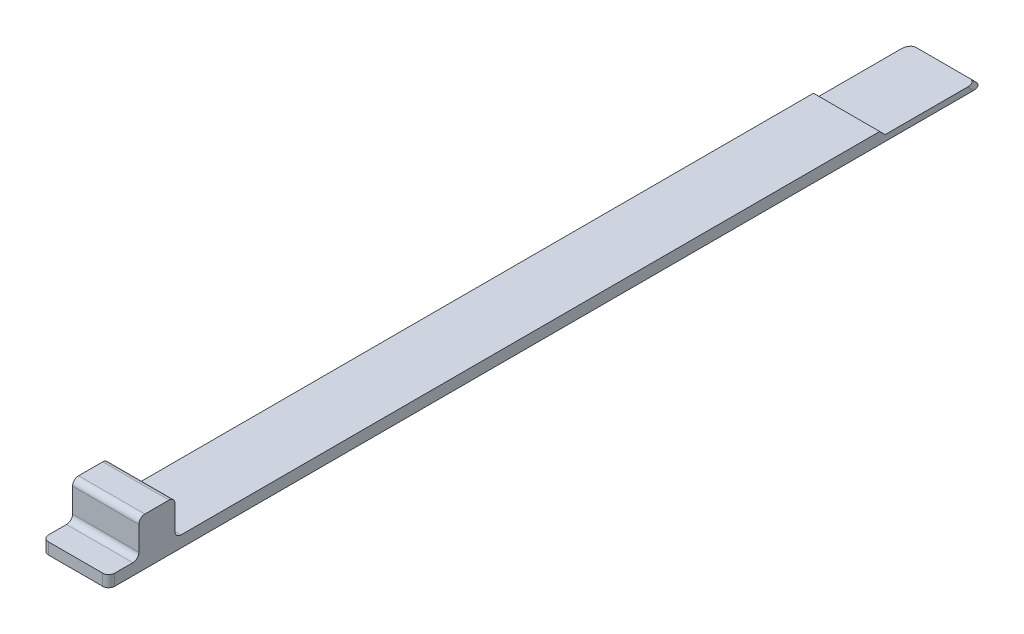
ISO-10303-21;
HEADER;
FILE_DESCRIPTION(('STEP AP214'),'2;1');
FILE_NAME('part.step','',(''),(''),'','','');
FILE_SCHEMA(('AUTOMOTIVE_DESIGN { 1 0 10303 214 1 1 1 1 }'));
ENDSEC;
DATA;
#1=APPLICATION_CONTEXT('core data for automotive mechanical design processes');
#2=APPLICATION_PROTOCOL_DEFINITION('international standard','automotive_design',2000,#1);
#3=PRODUCT_CONTEXT('',#1,'mechanical');
#4=PRODUCT('Part','Part','',(#3));
#5=PRODUCT_RELATED_PRODUCT_CATEGORY('part','',(#4));
#6=PRODUCT_DEFINITION_FORMATION('','',#4);
#7=PRODUCT_DEFINITION_CONTEXT('part definition',#1,'design');
#8=PRODUCT_DEFINITION('design','',#6,#7);
#9=PRODUCT_DEFINITION_SHAPE('','',#8);
#10=(LENGTH_UNIT() NAMED_UNIT(*) SI_UNIT(.MILLI.,.METRE.));
#11=(NAMED_UNIT(*) PLANE_ANGLE_UNIT() SI_UNIT($,.RADIAN.));
#12=(NAMED_UNIT(*) SI_UNIT($,.STERADIAN.) SOLID_ANGLE_UNIT());
#13=UNCERTAINTY_MEASURE_WITH_UNIT(LENGTH_MEASURE(1.E-05),#10,'distance_accuracy_value','');
#14=(GEOMETRIC_REPRESENTATION_CONTEXT(3) GLOBAL_UNCERTAINTY_ASSIGNED_CONTEXT((#13)) GLOBAL_UNIT_ASSIGNED_CONTEXT((#10,
#11,#12)) REPRESENTATION_CONTEXT('',''));
#15=CARTESIAN_POINT('',(0.,0.,0.));
#16=DIRECTION('',(0.,0.,1.));
#17=DIRECTION('',(1.,0.,0.));
#18=AXIS2_PLACEMENT_3D('',#15,#16,#17);
#19=CARTESIAN_POINT('',(0.,1.9,0.));
#20=DIRECTION('',(0.,1.,0.));
#21=DIRECTION('',(0.,0.,1.));
#22=AXIS2_PLACEMENT_3D('',#19,#20,#21);
#23=PLANE('',#22);
#24=DIRECTION('',(0.,0.,1.));
#25=VECTOR('',#24,1.);
#26=CARTESIAN_POINT('',(-5.50000000000001,1.9,-72.5));
#27=LINE('',#26,#25);
#28=CARTESIAN_POINT('',(-5.50000000000001,1.9,-55.5));
#29=VERTEX_POINT('',#28);
#30=CARTESIAN_POINT('',(-5.49999999999999,1.9,60.5));
#31=VERTEX_POINT('',#30);
#32=EDGE_CURVE('E299',#29,#31,#27,.T.);
#33=ORIENTED_EDGE('',*,*,#32,.T.);
#34=DIRECTION('',(-1.,0.,0.));
#35=VECTOR('',#34,1.);
#36=CARTESIAN_POINT('',(0.,1.9,60.5));
#37=LINE('',#36,#35);
#38=CARTESIAN_POINT('',(5.50000000000001,1.9,60.5));
#39=VERTEX_POINT('',#38);
#40=EDGE_CURVE('E174',#31,#39,#37,.F.);
#41=ORIENTED_EDGE('',*,*,#40,.T.);
#42=DIRECTION('',(0.,0.,-1.));
#43=VECTOR('',#42,1.);
#44=CARTESIAN_POINT('',(5.49999999999999,1.9,-72.5));
#45=LINE('',#44,#43);
#46=CARTESIAN_POINT('',(5.49999999999999,1.9,-55.5));
#47=VERTEX_POINT('',#46);
#48=EDGE_CURVE('E167',#39,#47,#45,.T.);
#49=ORIENTED_EDGE('',*,*,#48,.T.);
#50=DIRECTION('',(-1.,0.,0.));
#51=VECTOR('',#50,1.);
#52=CARTESIAN_POINT('',(-5.50000000000001,1.9,-55.5));
#53=LINE('',#52,#51);
#54=EDGE_CURVE('E171',#47,#29,#53,.T.);
#55=ORIENTED_EDGE('',*,*,#54,.T.);
#56=EDGE_LOOP('',(#33,#41,#49,#55));
#57=FACE_BOUND('',#56,.T.);
#58=ADVANCED_FACE('F41',(#57),#23,.T.);
#59=CARTESIAN_POINT('',(-5.50000000000001,1.9,-72.5));
#60=DIRECTION('',(1.,0.,0.));
#61=DIRECTION('',(0.,0.,-1.));
#62=AXIS2_PLACEMENT_3D('',#59,#60,#61);
#63=PLANE('',#62);
#64=DIRECTION('',(0.,0.,1.));
#65=VECTOR('',#64,1.);
#66=CARTESIAN_POINT('',(-5.50000000000001,1.,-56.5));
#67=LINE('',#66,#65);
#68=CARTESIAN_POINT('',(-5.50000000000001,1.,-70.0857864376269));
#69=VERTEX_POINT('',#68);
#70=CARTESIAN_POINT('',(-5.50000000000001,1.,-56.4));
#71=VERTEX_POINT('',#70);
#72=EDGE_CURVE('E290',#69,#71,#67,.T.);
#73=ORIENTED_EDGE('',*,*,#72,.F.);
#74=DIRECTION('',(0.,0.707106781186547,0.707106781186547));
#75=VECTOR('',#74,1.);
#76=CARTESIAN_POINT('',(-5.50000000000001,-0.707106781186549,-71.7928932188134));
#77=LINE('',#76,#75);
#78=CARTESIAN_POINT('',(-5.50000000000001,0.,-71.0857864376269));
#79=VERTEX_POINT('',#78);
#80=EDGE_CURVE('E234',#69,#79,#77,.F.);
#81=ORIENTED_EDGE('',*,*,#80,.T.);
#82=DIRECTION('',(0.,0.,1.));
#83=VECTOR('',#82,1.);
#84=CARTESIAN_POINT('',(-5.50000000000001,0.,-72.5));
#85=LINE('',#84,#83);
#86=CARTESIAN_POINT('',(-5.49999999999999,0.,71.5));
#87=VERTEX_POINT('',#86);
#88=EDGE_CURVE('E298',#79,#87,#85,.T.);
#89=ORIENTED_EDGE('',*,*,#88,.T.);
#90=DIRECTION('',(0.,-1.,0.));
#91=VECTOR('',#90,1.);
#92=CARTESIAN_POINT('',(-5.49999999999999,1.9,71.5));
#93=LINE('',#92,#91);
#94=CARTESIAN_POINT('',(-5.49999999999999,1.9,71.5));
#95=VERTEX_POINT('',#94);
#96=EDGE_CURVE('E232',#87,#95,#93,.F.);
#97=ORIENTED_EDGE('',*,*,#96,.T.);
#98=CARTESIAN_POINT('',(-5.49999999999999,1.9,68.5));
#99=VERTEX_POINT('',#98);
#100=EDGE_CURVE('E286',#99,#95,#27,.T.);
#101=ORIENTED_EDGE('',*,*,#100,.F.);
#102=CARTESIAN_POINT('',(-5.49999999999999,2.9,68.5));
#103=DIRECTION('',(1.,0.,0.));
#104=DIRECTION('',(0.,0.,-1.));
#105=AXIS2_PLACEMENT_3D('',#102,#103,#104);
#106=CIRCLE('',#105,1.);
#107=CARTESIAN_POINT('',(-5.50000000000001,2.9,67.5));
#108=VERTEX_POINT('',#107);
#109=EDGE_CURVE('E11',#99,#108,#106,.T.);
#110=ORIENTED_EDGE('',*,*,#109,.T.);
#111=DIRECTION('',(0.,-1.,0.));
#112=VECTOR('',#111,1.);
#113=CARTESIAN_POINT('',(-5.50000000000001,7.9,67.5));
#114=LINE('',#113,#112);
#115=CARTESIAN_POINT('',(-5.50000000000001,6.9,67.5));
#116=VERTEX_POINT('',#115);
#117=EDGE_CURVE('E284',#116,#108,#114,.T.);
#118=ORIENTED_EDGE('',*,*,#117,.F.);
#119=CARTESIAN_POINT('',(-5.49999999999999,6.9,66.5));
#120=DIRECTION('',(1.,0.,0.));
#121=DIRECTION('',(0.,0.,-1.));
#122=AXIS2_PLACEMENT_3D('',#119,#120,#121);
#123=CIRCLE('',#122,1.);
#124=CARTESIAN_POINT('',(-5.50000000000001,7.9,66.5));
#125=VERTEX_POINT('',#124);
#126=EDGE_CURVE('E228',#116,#125,#123,.F.);
#127=ORIENTED_EDGE('',*,*,#126,.T.);
#128=DIRECTION('',(0.,0.,1.));
#129=VECTOR('',#128,1.);
#130=CARTESIAN_POINT('',(-5.50000000000001,7.9,67.5));
#131=LINE('',#130,#129);
#132=CARTESIAN_POINT('',(-5.50000000000001,7.9,62.5));
#133=VERTEX_POINT('',#132);
#134=EDGE_CURVE('E354',#133,#125,#131,.T.);
#135=ORIENTED_EDGE('',*,*,#134,.F.);
#136=CARTESIAN_POINT('',(-5.49999999999999,6.9,62.5));
#137=DIRECTION('',(1.,0.,0.));
#138=DIRECTION('',(0.,0.,-1.));
#139=AXIS2_PLACEMENT_3D('',#136,#137,#138);
#140=CIRCLE('',#139,1.);
#141=CARTESIAN_POINT('',(-5.50000000000001,6.9,61.5));
#142=VERTEX_POINT('',#141);
#143=EDGE_CURVE('E230',#133,#142,#140,.F.);
#144=ORIENTED_EDGE('',*,*,#143,.T.);
#145=DIRECTION('',(0.,-1.,0.));
#146=VECTOR('',#145,1.);
#147=CARTESIAN_POINT('',(-5.50000000000001,7.9,61.5));
#148=LINE('',#147,#146);
#149=CARTESIAN_POINT('',(-5.50000000000001,2.9,61.5));
#150=VERTEX_POINT('',#149);
#151=EDGE_CURVE('E348',#142,#150,#148,.T.);
#152=ORIENTED_EDGE('',*,*,#151,.T.);
#153=CARTESIAN_POINT('',(-5.49999999999999,2.9,60.5));
#154=DIRECTION('',(1.,0.,0.));
#155=DIRECTION('',(0.,0.,-1.));
#156=AXIS2_PLACEMENT_3D('',#153,#154,#155);
#157=CIRCLE('',#156,1.);
#158=EDGE_CURVE('E263',#150,#31,#157,.T.);
#159=ORIENTED_EDGE('',*,*,#158,.T.);
#160=ORIENTED_EDGE('',*,*,#32,.F.);
#161=DIRECTION('',(0.,-0.707106781186551,-0.707106781186544));
#162=VECTOR('',#161,1.);
#163=CARTESIAN_POINT('',(-5.50000000000001,0.899999999999982,-56.5));
#164=LINE('',#163,#162);
#165=EDGE_CURVE('E193',#29,#71,#164,.T.);
#166=ORIENTED_EDGE('',*,*,#165,.T.);
#167=EDGE_LOOP('',(#73,#81,#89,#97,#101,#110,#118,#127,#135,#144,#152,#159,#160,#166));
#168=FACE_BOUND('',#167,.T.);
#169=ADVANCED_FACE('F283',(#168),#63,.F.);
#170=CARTESIAN_POINT('',(-5.49999999999999,1.9,72.5));
#171=DIRECTION('',(0.,0.,-1.));
#172=DIRECTION('',(-1.,0.,0.));
#173=AXIS2_PLACEMENT_3D('',#170,#171,#172);
#174=PLANE('',#173);
#175=DIRECTION('',(1.,0.,0.));
#176=VECTOR('',#175,1.);
#177=CARTESIAN_POINT('',(-5.49999999999999,1.9,72.5));
#178=LINE('',#177,#176);
#179=CARTESIAN_POINT('',(-4.49999999999999,1.9,72.5));
#180=VERTEX_POINT('',#179);
#181=CARTESIAN_POINT('',(4.50000000000001,1.9,72.5));
#182=VERTEX_POINT('',#181);
#183=EDGE_CURVE('E178',#180,#182,#178,.T.);
#184=ORIENTED_EDGE('',*,*,#183,.F.);
#185=DIRECTION('',(0.,-1.,0.));
#186=VECTOR('',#185,1.);
#187=CARTESIAN_POINT('',(-4.49999999999999,1.9,72.5));
#188=LINE('',#187,#186);
#189=CARTESIAN_POINT('',(-4.49999999999999,0.,72.5));
#190=VERTEX_POINT('',#189);
#191=EDGE_CURVE('E238',#180,#190,#188,.T.);
#192=ORIENTED_EDGE('',*,*,#191,.T.);
#193=DIRECTION('',(1.,0.,0.));
#194=VECTOR('',#193,1.);
#195=CARTESIAN_POINT('',(-5.49999999999999,0.,72.5));
#196=LINE('',#195,#194);
#197=CARTESIAN_POINT('',(4.50000000000001,0.,72.5));
#198=VERTEX_POINT('',#197);
#199=EDGE_CURVE('E304',#190,#198,#196,.T.);
#200=ORIENTED_EDGE('',*,*,#199,.T.);
#201=DIRECTION('',(0.,-1.,0.));
#202=VECTOR('',#201,1.);
#203=CARTESIAN_POINT('',(4.50000000000001,1.9,72.5));
#204=LINE('',#203,#202);
#205=EDGE_CURVE('E56',#198,#182,#204,.F.);
#206=ORIENTED_EDGE('',*,*,#205,.T.);
#207=EDGE_LOOP('',(#184,#192,#200,#206));
#208=FACE_BOUND('',#207,.T.);
#209=ADVANCED_FACE('F317',(#208),#174,.F.);
#210=CARTESIAN_POINT('',(5.49999999999999,1.9,-72.5));
#211=DIRECTION('',(-1.,0.,0.));
#212=DIRECTION('',(0.,0.,1.));
#213=AXIS2_PLACEMENT_3D('',#210,#211,#212);
#214=PLANE('',#213);
#215=DIRECTION('',(0.,0.,-1.));
#216=VECTOR('',#215,1.);
#217=CARTESIAN_POINT('',(5.49999999999999,0.,-72.5));
#218=LINE('',#217,#216);
#219=CARTESIAN_POINT('',(5.50000000000001,0.,71.5));
#220=VERTEX_POINT('',#219);
#221=CARTESIAN_POINT('',(5.49999999999999,0.,-71.0857864376269));
#222=VERTEX_POINT('',#221);
#223=EDGE_CURVE('E306',#220,#222,#218,.T.);
#224=ORIENTED_EDGE('',*,*,#223,.T.);
#225=DIRECTION('',(0.,-0.707106781186547,-0.707106781186547));
#226=VECTOR('',#225,1.);
#227=CARTESIAN_POINT('',(5.49999999999999,0.292893218813451,-70.7928932188134));
#228=LINE('',#227,#226);
#229=CARTESIAN_POINT('',(5.50000000000001,1.,-70.0857864376269));
#230=VERTEX_POINT('',#229);
#231=EDGE_CURVE('E210',#222,#230,#228,.F.);
#232=ORIENTED_EDGE('',*,*,#231,.T.);
#233=DIRECTION('',(0.,0.,-1.));
#234=VECTOR('',#233,1.);
#235=CARTESIAN_POINT('',(5.50000000000001,1.,-56.5));
#236=LINE('',#235,#234);
#237=CARTESIAN_POINT('',(5.49999999999999,1.,-56.4));
#238=VERTEX_POINT('',#237);
#239=EDGE_CURVE('E186',#238,#230,#236,.T.);
#240=ORIENTED_EDGE('',*,*,#239,.F.);
#241=DIRECTION('',(0.,0.707106781186551,0.707106781186544));
#242=VECTOR('',#241,1.);
#243=CARTESIAN_POINT('',(5.49999999999999,0.899999999999982,-56.5));
#244=LINE('',#243,#242);
#245=EDGE_CURVE('E181',#238,#47,#244,.T.);
#246=ORIENTED_EDGE('',*,*,#245,.T.);
#247=ORIENTED_EDGE('',*,*,#48,.F.);
#248=CARTESIAN_POINT('',(5.50000000000001,2.9,60.5));
#249=DIRECTION('',(-1.,0.,0.));
#250=DIRECTION('',(0.,0.,1.));
#251=AXIS2_PLACEMENT_3D('',#248,#249,#250);
#252=CIRCLE('',#251,1.);
#253=CARTESIAN_POINT('',(5.50000000000001,2.9,61.5));
#254=VERTEX_POINT('',#253);
#255=EDGE_CURVE('E265',#39,#254,#252,.T.);
#256=ORIENTED_EDGE('',*,*,#255,.T.);
#257=DIRECTION('',(0.,-1.,0.));
#258=VECTOR('',#257,1.);
#259=CARTESIAN_POINT('',(5.50000000000001,7.9,61.5));
#260=LINE('',#259,#258);
#261=CARTESIAN_POINT('',(5.50000000000001,6.9,61.5));
#262=VERTEX_POINT('',#261);
#263=EDGE_CURVE('E293',#262,#254,#260,.T.);
#264=ORIENTED_EDGE('',*,*,#263,.F.);
#265=CARTESIAN_POINT('',(5.50000000000001,6.9,62.5));
#266=DIRECTION('',(-1.,0.,0.));
#267=DIRECTION('',(0.,0.,1.));
#268=AXIS2_PLACEMENT_3D('',#265,#266,#267);
#269=CIRCLE('',#268,1.);
#270=CARTESIAN_POINT('',(5.50000000000001,7.9,62.5));
#271=VERTEX_POINT('',#270);
#272=EDGE_CURVE('E205',#262,#271,#269,.F.);
#273=ORIENTED_EDGE('',*,*,#272,.T.);
#274=DIRECTION('',(0.,0.,-1.));
#275=VECTOR('',#274,1.);
#276=CARTESIAN_POINT('',(5.50000000000001,7.9,67.5));
#277=LINE('',#276,#275);
#278=CARTESIAN_POINT('',(5.50000000000001,7.9,66.5));
#279=VERTEX_POINT('',#278);
#280=EDGE_CURVE('E349',#279,#271,#277,.T.);
#281=ORIENTED_EDGE('',*,*,#280,.F.);
#282=CARTESIAN_POINT('',(5.50000000000001,6.9,66.5));
#283=DIRECTION('',(-1.,0.,0.));
#284=DIRECTION('',(0.,0.,1.));
#285=AXIS2_PLACEMENT_3D('',#282,#283,#284);
#286=CIRCLE('',#285,1.);
#287=CARTESIAN_POINT('',(5.50000000000001,6.9,67.5));
#288=VERTEX_POINT('',#287);
#289=EDGE_CURVE('E203',#279,#288,#286,.F.);
#290=ORIENTED_EDGE('',*,*,#289,.T.);
#291=DIRECTION('',(0.,-1.,0.));
#292=VECTOR('',#291,1.);
#293=CARTESIAN_POINT('',(5.50000000000001,7.9,67.5));
#294=LINE('',#293,#292);
#295=CARTESIAN_POINT('',(5.50000000000001,2.9,67.5));
#296=VERTEX_POINT('',#295);
#297=EDGE_CURVE('E271',#288,#296,#294,.T.);
#298=ORIENTED_EDGE('',*,*,#297,.T.);
#299=CARTESIAN_POINT('',(5.50000000000001,2.9,68.5));
#300=DIRECTION('',(-1.,0.,0.));
#301=DIRECTION('',(0.,0.,1.));
#302=AXIS2_PLACEMENT_3D('',#299,#300,#301);
#303=CIRCLE('',#302,1.);
#304=CARTESIAN_POINT('',(5.50000000000001,1.9,68.5));
#305=VERTEX_POINT('',#304);
#306=EDGE_CURVE('E49',#296,#305,#303,.T.);
#307=ORIENTED_EDGE('',*,*,#306,.T.);
#308=CARTESIAN_POINT('',(5.50000000000001,1.9,71.5));
#309=VERTEX_POINT('',#308);
#310=EDGE_CURVE('E177',#309,#305,#45,.T.);
#311=ORIENTED_EDGE('',*,*,#310,.F.);
#312=DIRECTION('',(0.,-1.,0.));
#313=VECTOR('',#312,1.);
#314=CARTESIAN_POINT('',(5.50000000000001,1.9,71.5));
#315=LINE('',#314,#313);
#316=EDGE_CURVE('E207',#309,#220,#315,.T.);
#317=ORIENTED_EDGE('',*,*,#316,.T.);
#318=EDGE_LOOP('',(#224,#232,#240,#246,#247,#256,#264,#273,#281,#290,#298,#307,#311,#317));
#319=FACE_BOUND('',#318,.T.);
#320=ADVANCED_FACE('F183',(#319),#214,.F.);
#321=ORIENTED_EDGE('',*,*,#100,.T.);
#322=CARTESIAN_POINT('',(-4.49999999999999,1.9,71.5));
#323=DIRECTION('',(0.,1.,0.));
#324=DIRECTION('',(0.,0.,1.));
#325=AXIS2_PLACEMENT_3D('',#322,#323,#324);
#326=CIRCLE('',#325,1.);
#327=EDGE_CURVE('E63',#95,#180,#326,.T.);
#328=ORIENTED_EDGE('',*,*,#327,.T.);
#329=ORIENTED_EDGE('',*,*,#183,.T.);
#330=CARTESIAN_POINT('',(4.50000000000001,1.9,71.5));
#331=DIRECTION('',(0.,1.,0.));
#332=DIRECTION('',(0.,0.,1.));
#333=AXIS2_PLACEMENT_3D('',#330,#331,#332);
#334=CIRCLE('',#333,1.);
#335=EDGE_CURVE('E243',#182,#309,#334,.T.);
#336=ORIENTED_EDGE('',*,*,#335,.T.);
#337=ORIENTED_EDGE('',*,*,#310,.T.);
#338=DIRECTION('',(1.,0.,0.));
#339=VECTOR('',#338,1.);
#340=CARTESIAN_POINT('',(0.,1.9,68.5));
#341=LINE('',#340,#339);
#342=EDGE_CURVE('E241',#305,#99,#341,.F.);
#343=ORIENTED_EDGE('',*,*,#342,.T.);
#344=EDGE_LOOP('',(#321,#328,#329,#336,#337,#343));
#345=FACE_BOUND('',#344,.T.);
#346=ADVANCED_FACE('F275',(#345),#23,.T.);
#347=CARTESIAN_POINT('',(0.,0.,0.));
#348=DIRECTION('',(0.,1.,0.));
#349=DIRECTION('',(0.,0.,1.));
#350=AXIS2_PLACEMENT_3D('',#347,#348,#349);
#351=PLANE('',#350);
#352=DIRECTION('',(-1.,0.,0.));
#353=VECTOR('',#352,1.);
#354=CARTESIAN_POINT('',(-5.50000000000001,0.,-72.5));
#355=LINE('',#354,#353);
#356=CARTESIAN_POINT('',(4.49999999999999,0.,-72.5));
#357=VERTEX_POINT('',#356);
#358=CARTESIAN_POINT('',(-4.50000000000001,0.,-72.5));
#359=VERTEX_POINT('',#358);
#360=EDGE_CURVE('E307',#357,#359,#355,.T.);
#361=ORIENTED_EDGE('',*,*,#360,.F.);
#362=CARTESIAN_POINT('',(4.49999999999999,0.,-71.0857864376269));
#363=DIRECTION('',(0.,1.,0.));
#364=DIRECTION('',(0.,0.,1.));
#365=AXIS2_PLACEMENT_3D('',#362,#363,#364);
#366=ELLIPSE('',#365,1.4142135623731,1.);
#367=EDGE_CURVE('E226',#357,#222,#366,.F.);
#368=ORIENTED_EDGE('',*,*,#367,.T.);
#369=ORIENTED_EDGE('',*,*,#223,.F.);
#370=CARTESIAN_POINT('',(4.50000000000001,0.,71.5));
#371=DIRECTION('',(0.,1.,0.));
#372=DIRECTION('',(0.,0.,1.));
#373=AXIS2_PLACEMENT_3D('',#370,#371,#372);
#374=CIRCLE('',#373,1.);
#375=EDGE_CURVE('E220',#220,#198,#374,.F.);
#376=ORIENTED_EDGE('',*,*,#375,.T.);
#377=ORIENTED_EDGE('',*,*,#199,.F.);
#378=CARTESIAN_POINT('',(-4.49999999999999,0.,71.5));
#379=DIRECTION('',(0.,1.,0.));
#380=DIRECTION('',(0.,0.,1.));
#381=AXIS2_PLACEMENT_3D('',#378,#379,#380);
#382=CIRCLE('',#381,1.);
#383=EDGE_CURVE('E222',#190,#87,#382,.F.);
#384=ORIENTED_EDGE('',*,*,#383,.T.);
#385=ORIENTED_EDGE('',*,*,#88,.F.);
#386=CARTESIAN_POINT('',(-4.50000000000001,0.,-71.0857864376269));
#387=DIRECTION('',(0.,1.,0.));
#388=DIRECTION('',(0.,0.,-1.));
#389=AXIS2_PLACEMENT_3D('',#386,#387,#388);
#390=ELLIPSE('',#389,1.4142135623731,1.);
#391=EDGE_CURVE('E224',#79,#359,#390,.F.);
#392=ORIENTED_EDGE('',*,*,#391,.T.);
#393=EDGE_LOOP('',(#361,#368,#369,#376,#377,#384,#385,#392));
#394=FACE_BOUND('',#393,.T.);
#395=ADVANCED_FACE('F319',(#394),#351,.F.);
#396=CARTESIAN_POINT('',(0.,1.,0.));
#397=DIRECTION('',(0.,-1.,0.));
#398=DIRECTION('',(0.,0.,-1.));
#399=AXIS2_PLACEMENT_3D('',#396,#397,#398);
#400=PLANE('',#399);
#401=ORIENTED_EDGE('',*,*,#239,.T.);
#402=CARTESIAN_POINT('',(4.49999999999999,1.,-70.0857864376269));
#403=DIRECTION('',(0.,-1.,0.));
#404=DIRECTION('',(0.,0.,1.));
#405=AXIS2_PLACEMENT_3D('',#402,#403,#404);
#406=ELLIPSE('',#405,1.4142135623731,1.);
#407=CARTESIAN_POINT('',(4.49999999999999,1.,-71.5));
#408=VERTEX_POINT('',#407);
#409=EDGE_CURVE('E214',#230,#408,#406,.F.);
#410=ORIENTED_EDGE('',*,*,#409,.T.);
#411=DIRECTION('',(-1.,0.,0.));
#412=VECTOR('',#411,1.);
#413=CARTESIAN_POINT('',(0.,1.,-71.5));
#414=LINE('',#413,#412);
#415=CARTESIAN_POINT('',(-4.50000000000001,1.,-71.5));
#416=VERTEX_POINT('',#415);
#417=EDGE_CURVE('E195',#408,#416,#414,.T.);
#418=ORIENTED_EDGE('',*,*,#417,.T.);
#419=CARTESIAN_POINT('',(-4.50000000000001,1.,-70.0857864376269));
#420=DIRECTION('',(0.,-1.,0.));
#421=DIRECTION('',(0.,0.,-1.));
#422=AXIS2_PLACEMENT_3D('',#419,#420,#421);
#423=ELLIPSE('',#422,1.4142135623731,1.);
#424=EDGE_CURVE('E212',#416,#69,#423,.F.);
#425=ORIENTED_EDGE('',*,*,#424,.T.);
#426=ORIENTED_EDGE('',*,*,#72,.T.);
#427=DIRECTION('',(1.,0.,0.));
#428=VECTOR('',#427,1.);
#429=CARTESIAN_POINT('',(0.,1.,-56.4));
#430=LINE('',#429,#428);
#431=EDGE_CURVE('E201',#71,#238,#430,.T.);
#432=ORIENTED_EDGE('',*,*,#431,.T.);
#433=EDGE_LOOP('',(#401,#410,#418,#425,#426,#432));
#434=FACE_BOUND('',#433,.T.);
#435=ADVANCED_FACE('F331',(#434),#400,.F.);
#436=CARTESIAN_POINT('',(-5.50000000000001,0.899999999999982,-56.5));
#437=DIRECTION('',(0.,0.707106781186544,-0.707106781186551));
#438=DIRECTION('',(-1.,0.,0.));
#439=AXIS2_PLACEMENT_3D('',#436,#437,#438);
#440=PLANE('',#439);
#441=ORIENTED_EDGE('',*,*,#165,.F.);
#442=ORIENTED_EDGE('',*,*,#54,.F.);
#443=ORIENTED_EDGE('',*,*,#245,.F.);
#444=ORIENTED_EDGE('',*,*,#431,.F.);
#445=EDGE_LOOP('',(#441,#442,#443,#444));
#446=FACE_BOUND('',#445,.T.);
#447=ADVANCED_FACE('F191',(#446),#440,.T.);
#448=CARTESIAN_POINT('',(0.,1.,-71.5));
#449=DIRECTION('',(0.,-0.707106781186547,0.707106781186547));
#450=DIRECTION('',(-1.,0.,0.));
#451=AXIS2_PLACEMENT_3D('',#448,#449,#450);
#452=PLANE('',#451);
#453=ORIENTED_EDGE('',*,*,#417,.F.);
#454=DIRECTION('',(0.,0.707106781186548,0.707106781186548));
#455=VECTOR('',#454,1.);
#456=CARTESIAN_POINT('',(4.49999999999999,0.,-72.5));
#457=LINE('',#456,#455);
#458=EDGE_CURVE('E218',#408,#357,#457,.F.);
#459=ORIENTED_EDGE('',*,*,#458,.T.);
#460=ORIENTED_EDGE('',*,*,#360,.T.);
#461=DIRECTION('',(0.,-0.707106781186548,-0.707106781186548));
#462=VECTOR('',#461,1.);
#463=CARTESIAN_POINT('',(-4.50000000000001,0.999999999999999,-71.5));
#464=LINE('',#463,#462);
#465=EDGE_CURVE('E216',#359,#416,#464,.F.);
#466=ORIENTED_EDGE('',*,*,#465,.T.);
#467=EDGE_LOOP('',(#453,#459,#460,#466));
#468=FACE_BOUND('',#467,.T.);
#469=ADVANCED_FACE('F333',(#468),#452,.F.);
#470=CARTESIAN_POINT('',(-5.50000000000001,7.9,67.5));
#471=DIRECTION('',(0.,0.,-1.));
#472=DIRECTION('',(-1.,0.,0.));
#473=AXIS2_PLACEMENT_3D('',#470,#471,#472);
#474=PLANE('',#473);
#475=ORIENTED_EDGE('',*,*,#297,.F.);
#476=DIRECTION('',(1.,0.,0.));
#477=VECTOR('',#476,1.);
#478=CARTESIAN_POINT('',(-5.50000000000001,6.9,67.5));
#479=LINE('',#478,#477);
#480=EDGE_CURVE('E261',#288,#116,#479,.F.);
#481=ORIENTED_EDGE('',*,*,#480,.T.);
#482=ORIENTED_EDGE('',*,*,#117,.T.);
#483=DIRECTION('',(1.,0.,0.));
#484=VECTOR('',#483,1.);
#485=CARTESIAN_POINT('',(-5.50000000000001,2.9,67.5));
#486=LINE('',#485,#484);
#487=EDGE_CURVE('E258',#108,#296,#486,.T.);
#488=ORIENTED_EDGE('',*,*,#487,.T.);
#489=EDGE_LOOP('',(#475,#481,#482,#488));
#490=FACE_BOUND('',#489,.T.);
#491=ADVANCED_FACE('F288',(#490),#474,.F.);
#492=CARTESIAN_POINT('',(-5.50000000000001,7.9,61.5));
#493=DIRECTION('',(0.,0.,1.));
#494=DIRECTION('',(1.,0.,0.));
#495=AXIS2_PLACEMENT_3D('',#492,#493,#494);
#496=PLANE('',#495);
#497=ORIENTED_EDGE('',*,*,#263,.T.);
#498=DIRECTION('',(-1.,0.,0.));
#499=VECTOR('',#498,1.);
#500=CARTESIAN_POINT('',(-5.50000000000001,2.9,61.5));
#501=LINE('',#500,#499);
#502=EDGE_CURVE('E248',#254,#150,#501,.T.);
#503=ORIENTED_EDGE('',*,*,#502,.T.);
#504=ORIENTED_EDGE('',*,*,#151,.F.);
#505=DIRECTION('',(-1.,0.,0.));
#506=VECTOR('',#505,1.);
#507=CARTESIAN_POINT('',(-5.50000000000001,6.9,61.5));
#508=LINE('',#507,#506);
#509=EDGE_CURVE('E246',#142,#262,#508,.F.);
#510=ORIENTED_EDGE('',*,*,#509,.T.);
#511=EDGE_LOOP('',(#497,#503,#504,#510));
#512=FACE_BOUND('',#511,.T.);
#513=ADVANCED_FACE('F345',(#512),#496,.F.);
#514=CARTESIAN_POINT('',(0.,7.9,0.));
#515=DIRECTION('',(0.,-1.,0.));
#516=DIRECTION('',(0.,0.,-1.));
#517=AXIS2_PLACEMENT_3D('',#514,#515,#516);
#518=PLANE('',#517);
#519=ORIENTED_EDGE('',*,*,#280,.T.);
#520=DIRECTION('',(-1.,0.,0.));
#521=VECTOR('',#520,1.);
#522=CARTESIAN_POINT('',(0.,7.9,62.5));
#523=LINE('',#522,#521);
#524=EDGE_CURVE('E255',#271,#133,#523,.T.);
#525=ORIENTED_EDGE('',*,*,#524,.T.);
#526=ORIENTED_EDGE('',*,*,#134,.T.);
#527=DIRECTION('',(1.,0.,0.));
#528=VECTOR('',#527,1.);
#529=CARTESIAN_POINT('',(0.,7.9,66.5));
#530=LINE('',#529,#528);
#531=EDGE_CURVE('E252',#125,#279,#530,.T.);
#532=ORIENTED_EDGE('',*,*,#531,.T.);
#533=EDGE_LOOP('',(#519,#525,#526,#532));
#534=FACE_BOUND('',#533,.T.);
#535=ADVANCED_FACE('F359',(#534),#518,.F.);
#536=CARTESIAN_POINT('',(4.49999999999999,0.242893218813453,-70.8428932188134));
#537=DIRECTION('',(0.,0.707106781186547,0.707106781186547));
#538=DIRECTION('',(0.,-0.707106781186548,0.707106781186548));
#539=AXIS2_PLACEMENT_3D('',#536,#537,#538);
#540=CYLINDRICAL_SURFACE('',#539,1.);
#541=ORIENTED_EDGE('',*,*,#367,.F.);
#542=ORIENTED_EDGE('',*,*,#458,.F.);
#543=ORIENTED_EDGE('',*,*,#409,.F.);
#544=ORIENTED_EDGE('',*,*,#231,.F.);
#545=EDGE_LOOP('',(#541,#542,#543,#544));
#546=FACE_BOUND('',#545,.T.);
#547=ADVANCED_FACE('F327',(#546),#540,.T.);
#548=CARTESIAN_POINT('',(-4.50000000000001,0.242893218813453,-70.8428932188134));
#549=DIRECTION('',(0.,-0.707106781186547,-0.707106781186547));
#550=DIRECTION('',(0.,0.707106781186548,-0.707106781186548));
#551=AXIS2_PLACEMENT_3D('',#548,#549,#550);
#552=CYLINDRICAL_SURFACE('',#551,1.);
#553=ORIENTED_EDGE('',*,*,#424,.F.);
#554=ORIENTED_EDGE('',*,*,#465,.F.);
#555=ORIENTED_EDGE('',*,*,#391,.F.);
#556=ORIENTED_EDGE('',*,*,#80,.F.);
#557=EDGE_LOOP('',(#553,#554,#555,#556));
#558=FACE_BOUND('',#557,.T.);
#559=ADVANCED_FACE('F335',(#558),#552,.T.);
#560=CARTESIAN_POINT('',(-4.49999999999999,1.9,71.5));
#561=DIRECTION('',(0.,-1.,0.));
#562=DIRECTION('',(0.,0.,-1.));
#563=AXIS2_PLACEMENT_3D('',#560,#561,#562);
#564=CYLINDRICAL_SURFACE('',#563,1.);
#565=ORIENTED_EDGE('',*,*,#327,.F.);
#566=ORIENTED_EDGE('',*,*,#96,.F.);
#567=ORIENTED_EDGE('',*,*,#383,.F.);
#568=ORIENTED_EDGE('',*,*,#191,.F.);
#569=EDGE_LOOP('',(#565,#566,#567,#568));
#570=FACE_BOUND('',#569,.T.);
#571=ADVANCED_FACE('F315',(#570),#564,.T.);
#572=CARTESIAN_POINT('',(4.50000000000001,1.9,71.5));
#573=DIRECTION('',(0.,-1.,0.));
#574=DIRECTION('',(0.,0.,-1.));
#575=AXIS2_PLACEMENT_3D('',#572,#573,#574);
#576=CYLINDRICAL_SURFACE('',#575,1.);
#577=ORIENTED_EDGE('',*,*,#335,.F.);
#578=ORIENTED_EDGE('',*,*,#205,.F.);
#579=ORIENTED_EDGE('',*,*,#375,.F.);
#580=ORIENTED_EDGE('',*,*,#316,.F.);
#581=EDGE_LOOP('',(#577,#578,#579,#580));
#582=FACE_BOUND('',#581,.T.);
#583=ADVANCED_FACE('F323',(#582),#576,.T.);
#584=CARTESIAN_POINT('',(-5.50000000000001,2.9,60.5));
#585=DIRECTION('',(-1.,0.,0.));
#586=DIRECTION('',(0.,0.,1.));
#587=AXIS2_PLACEMENT_3D('',#584,#585,#586);
#588=CYLINDRICAL_SURFACE('',#587,1.);
#589=ORIENTED_EDGE('',*,*,#255,.F.);
#590=ORIENTED_EDGE('',*,*,#40,.F.);
#591=ORIENTED_EDGE('',*,*,#158,.F.);
#592=ORIENTED_EDGE('',*,*,#502,.F.);
#593=EDGE_LOOP('',(#589,#590,#591,#592));
#594=FACE_BOUND('',#593,.T.);
#595=ADVANCED_FACE('F339',(#594),#588,.F.);
#596=CARTESIAN_POINT('',(0.,6.9,62.5));
#597=DIRECTION('',(-1.,0.,0.));
#598=DIRECTION('',(0.,0.,1.));
#599=AXIS2_PLACEMENT_3D('',#596,#597,#598);
#600=CYLINDRICAL_SURFACE('',#599,1.);
#601=ORIENTED_EDGE('',*,*,#272,.F.);
#602=ORIENTED_EDGE('',*,*,#509,.F.);
#603=ORIENTED_EDGE('',*,*,#143,.F.);
#604=ORIENTED_EDGE('',*,*,#524,.F.);
#605=EDGE_LOOP('',(#601,#602,#603,#604));
#606=FACE_BOUND('',#605,.T.);
#607=ADVANCED_FACE('F365',(#606),#600,.T.);
#608=CARTESIAN_POINT('',(0.,6.9,66.5));
#609=DIRECTION('',(1.,0.,0.));
#610=DIRECTION('',(0.,0.,-1.));
#611=AXIS2_PLACEMENT_3D('',#608,#609,#610);
#612=CYLINDRICAL_SURFACE('',#611,1.);
#613=ORIENTED_EDGE('',*,*,#126,.F.);
#614=ORIENTED_EDGE('',*,*,#480,.F.);
#615=ORIENTED_EDGE('',*,*,#289,.F.);
#616=ORIENTED_EDGE('',*,*,#531,.F.);
#617=EDGE_LOOP('',(#613,#614,#615,#616));
#618=FACE_BOUND('',#617,.T.);
#619=ADVANCED_FACE('F363',(#618),#612,.T.);
#620=CARTESIAN_POINT('',(-5.50000000000001,2.9,68.5));
#621=DIRECTION('',(1.,0.,0.));
#622=DIRECTION('',(0.,0.,-1.));
#623=AXIS2_PLACEMENT_3D('',#620,#621,#622);
#624=CYLINDRICAL_SURFACE('',#623,1.);
#625=ORIENTED_EDGE('',*,*,#109,.F.);
#626=ORIENTED_EDGE('',*,*,#342,.F.);
#627=ORIENTED_EDGE('',*,*,#306,.F.);
#628=ORIENTED_EDGE('',*,*,#487,.F.);
#629=EDGE_LOOP('',(#625,#626,#627,#628));
#630=FACE_BOUND('',#629,.T.);
#631=ADVANCED_FACE('F43',(#630),#624,.F.);
#632=CLOSED_SHELL('',(#58,#169,#209,#320,#346,#395,#435,#447,#469,#491,#513,#535,#547,#559,#571,
#583,#595,#607,#619,#631));
#633=MANIFOLD_SOLID_BREP('B2',#632);
#634=ADVANCED_BREP_SHAPE_REPRESENTATION('',(#18,#633),#14);
#635=SHAPE_DEFINITION_REPRESENTATION(#9,#634);
ENDSEC;
END-ISO-10303-21;
